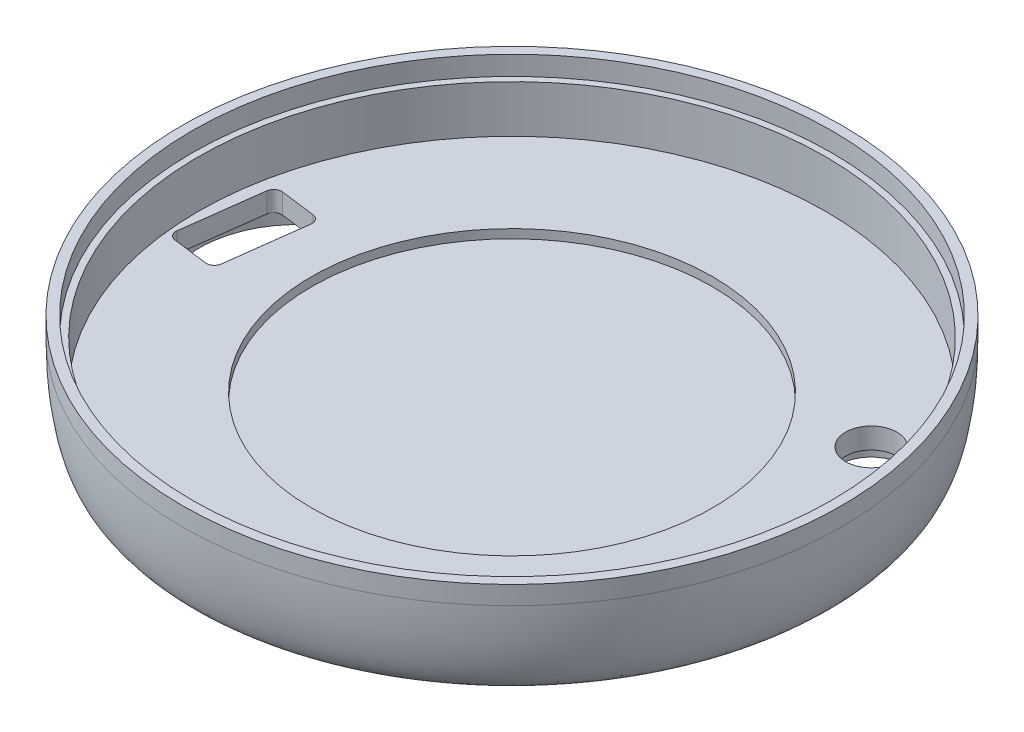
ISO-10303-21;
HEADER;
FILE_DESCRIPTION(('STEP AP214'),'2;1');
FILE_NAME('part.step','',(''),(''),'','','');
FILE_SCHEMA(('AUTOMOTIVE_DESIGN { 1 0 10303 214 1 1 1 1 }'));
ENDSEC;
DATA;
#1=APPLICATION_CONTEXT('core data for automotive mechanical design processes');
#2=APPLICATION_PROTOCOL_DEFINITION('international standard','automotive_design',2000,#1);
#3=PRODUCT_CONTEXT('',#1,'mechanical');
#4=PRODUCT('Part','Part','',(#3));
#5=PRODUCT_RELATED_PRODUCT_CATEGORY('part','',(#4));
#6=PRODUCT_DEFINITION_FORMATION('','',#4);
#7=PRODUCT_DEFINITION_CONTEXT('part definition',#1,'design');
#8=PRODUCT_DEFINITION('design','',#6,#7);
#9=PRODUCT_DEFINITION_SHAPE('','',#8);
#10=(LENGTH_UNIT() NAMED_UNIT(*) SI_UNIT(.MILLI.,.METRE.));
#11=(NAMED_UNIT(*) PLANE_ANGLE_UNIT() SI_UNIT($,.RADIAN.));
#12=(NAMED_UNIT(*) SI_UNIT($,.STERADIAN.) SOLID_ANGLE_UNIT());
#13=UNCERTAINTY_MEASURE_WITH_UNIT(LENGTH_MEASURE(1.E-05),#10,'distance_accuracy_value','');
#14=(GEOMETRIC_REPRESENTATION_CONTEXT(3) GLOBAL_UNCERTAINTY_ASSIGNED_CONTEXT((#13)) GLOBAL_UNIT_ASSIGNED_CONTEXT((#10,
#11,#12)) REPRESENTATION_CONTEXT('',''));
#15=CARTESIAN_POINT('',(0.,0.,0.));
#16=DIRECTION('',(0.,0.,1.));
#17=DIRECTION('',(1.,0.,0.));
#18=AXIS2_PLACEMENT_3D('',#15,#16,#17);
#19=CARTESIAN_POINT('',(14.1508537706222,6.151,-8.2502947048077));
#20=DIRECTION('',(0.,-1.,0.));
#21=DIRECTION('',(0.,0.,-1.));
#22=AXIS2_PLACEMENT_3D('',#19,#20,#21);
#23=CYLINDRICAL_SURFACE('',#22,1.6);
#24=CARTESIAN_POINT('',(14.1508537706222,2.,-8.2502947048077));
#25=DIRECTION('',(0.,1.,0.));
#26=DIRECTION('',(0.,0.,1.));
#27=AXIS2_PLACEMENT_3D('',#24,#25,#26);
#28=CIRCLE('',#27,1.6);
#29=CARTESIAN_POINT('',(14.1508537706222,2.,-6.6502947048077));
#30=VERTEX_POINT('',#29);
#31=EDGE_CURVE('E143',#30,#30,#28,.F.);
#32=ORIENTED_EDGE('',*,*,#31,.F.);
#33=EDGE_LOOP('',(#32));
#34=FACE_BOUND('',#33,.T.);
#35=CARTESIAN_POINT('',(14.1508537706222,0.7,-8.2502947048077));
#36=DIRECTION('',(0.,-1.,0.));
#37=DIRECTION('',(0.,0.,-1.));
#38=AXIS2_PLACEMENT_3D('',#35,#36,#37);
#39=CIRCLE('',#38,1.6);
#40=CARTESIAN_POINT('',(14.1508537706222,0.7,-9.8502947048077));
#41=VERTEX_POINT('',#40);
#42=EDGE_CURVE('E53',#41,#41,#39,.F.);
#43=ORIENTED_EDGE('',*,*,#42,.F.);
#44=EDGE_LOOP('',(#43));
#45=FACE_BOUND('',#44,.T.);
#46=ADVANCED_FACE('F49',(#34,#45),#23,.F.);
#47=CARTESIAN_POINT('',(-19.2297204076441,5.05,2.22079728835427));
#48=DIRECTION('',(0.991724413132395,0.,0.12838492277992));
#49=DIRECTION('',(0.12838492277992,0.,-0.991724413132395));
#50=AXIS2_PLACEMENT_3D('',#47,#48,#49);
#51=PLANE('',#50);
#52=DIRECTION('',(0.,-1.,0.));
#53=VECTOR('',#52,1.);
#54=CARTESIAN_POINT('',(-19.1655279462541,0.,1.72493508178808));
#55=LINE('',#54,#53);
#56=CARTESIAN_POINT('',(-19.1655279462541,2.,1.72493508178808));
#57=VERTEX_POINT('',#56);
#58=CARTESIAN_POINT('',(-19.1655279462541,0.75,1.72493508178808));
#59=VERTEX_POINT('',#58);
#60=EDGE_CURVE('E124',#57,#59,#55,.T.);
#61=ORIENTED_EDGE('',*,*,#60,.T.);
#62=DIRECTION('',(0.12838492277992,0.,-0.991724413132395));
#63=VECTOR('',#62,1.);
#64=CARTESIAN_POINT('',(-19.2297204076441,0.75,2.22079728835427));
#65=LINE('',#64,#63);
#66=CARTESIAN_POINT('',(-18.5236033323545,0.75,-3.2336869838739));
#67=VERTEX_POINT('',#66);
#68=EDGE_CURVE('E274',#59,#67,#65,.T.);
#69=ORIENTED_EDGE('',*,*,#68,.T.);
#70=DIRECTION('',(0.,-1.,0.));
#71=VECTOR('',#70,1.);
#72=CARTESIAN_POINT('',(-18.5236033323545,2.05,-3.2336869838739));
#73=LINE('',#72,#71);
#74=CARTESIAN_POINT('',(-18.5236033323545,2.,-3.2336869838739));
#75=VERTEX_POINT('',#74);
#76=EDGE_CURVE('E120',#67,#75,#73,.F.);
#77=ORIENTED_EDGE('',*,*,#76,.T.);
#78=DIRECTION('',(0.12838492277992,0.,-0.991724413132395));
#79=VECTOR('',#78,1.);
#80=CARTESIAN_POINT('',(-18.4239719344364,2.,-4.00330141748866));
#81=LINE('',#80,#79);
#82=EDGE_CURVE('E114',#57,#75,#81,.T.);
#83=ORIENTED_EDGE('',*,*,#82,.F.);
#84=EDGE_LOOP('',(#61,#69,#77,#83));
#85=FACE_BOUND('',#84,.T.);
#86=ADVANCED_FACE('F186',(#85),#51,.T.);
#87=CARTESIAN_POINT('',(-16.0562022856204,5.05,2.63162904125002));
#88=DIRECTION('',(0.12838492277992,0.,-0.991724413132395));
#89=DIRECTION('',(-0.991724413132395,0.,-0.12838492277992));
#90=AXIS2_PLACEMENT_3D('',#87,#88,#89);
#91=PLANE('',#90);
#92=DIRECTION('',(0.,-1.,0.));
#93=VECTOR('',#92,1.);
#94=CARTESIAN_POINT('',(-16.5520644921866,0.,2.56743657986006));
#95=LINE('',#94,#93);
#96=CARTESIAN_POINT('',(-16.5520644921866,2.,2.56743657986006));
#97=VERTEX_POINT('',#96);
#98=CARTESIAN_POINT('',(-16.5520644921866,0.75,2.56743657986006));
#99=VERTEX_POINT('',#98);
#100=EDGE_CURVE('E111',#97,#99,#95,.T.);
#101=ORIENTED_EDGE('',*,*,#100,.T.);
#102=DIRECTION('',(-0.991724413132395,0.,-0.12838492277992));
#103=VECTOR('',#102,1.);
#104=CARTESIAN_POINT('',(-16.0562022856204,0.75,2.63162904125002));
#105=LINE('',#104,#103);
#106=CARTESIAN_POINT('',(-18.7338582010779,0.75,2.28498974974423));
#107=VERTEX_POINT('',#106);
#108=EDGE_CURVE('E287',#99,#107,#105,.T.);
#109=ORIENTED_EDGE('',*,*,#108,.T.);
#110=DIRECTION('',(0.,-1.,0.));
#111=VECTOR('',#110,1.);
#112=CARTESIAN_POINT('',(-18.7338582010779,2.05,2.28498974974423));
#113=LINE('',#112,#111);
#114=CARTESIAN_POINT('',(-18.7338582010779,2.,2.28498974974423));
#115=VERTEX_POINT('',#114);
#116=EDGE_CURVE('E113',#107,#115,#113,.F.);
#117=ORIENTED_EDGE('',*,*,#116,.T.);
#118=DIRECTION('',(-0.991724413132395,0.,-0.12838492277992));
#119=VECTOR('',#118,1.);
#120=CARTESIAN_POINT('',(11.6942515267923,2.,6.22409870584294));
#121=LINE('',#120,#119);
#122=EDGE_CURVE('E97',#97,#115,#121,.T.);
#123=ORIENTED_EDGE('',*,*,#122,.F.);
#124=EDGE_LOOP('',(#101,#109,#117,#123));
#125=FACE_BOUND('',#124,.T.);
#126=ADVANCED_FACE('F108',(#125),#91,.T.);
#127=CARTESIAN_POINT('',(-15.2858927489409,5.05,-3.31871743754435));
#128=DIRECTION('',(-0.991724413132395,0.,-0.12838492277992));
#129=DIRECTION('',(-0.12838492277992,0.,0.991724413132395));
#130=AXIS2_PLACEMENT_3D('',#127,#128,#129);
#131=PLANE('',#130);
#132=DIRECTION('',(0.,-1.,0.));
#133=VECTOR('',#132,1.);
#134=CARTESIAN_POINT('',(-15.3500852103309,0.,-2.82285523097816));
#135=LINE('',#134,#133);
#136=CARTESIAN_POINT('',(-15.3500852103309,2.,-2.82285523097816));
#137=VERTEX_POINT('',#136);
#138=CARTESIAN_POINT('',(-15.3500852103309,0.75,-2.82285523097816));
#139=VERTEX_POINT('',#138);
#140=EDGE_CURVE('E122',#137,#139,#135,.T.);
#141=ORIENTED_EDGE('',*,*,#140,.T.);
#142=DIRECTION('',(-0.12838492277992,0.,0.991724413132395));
#143=VECTOR('',#142,1.);
#144=CARTESIAN_POINT('',(-15.2858927489409,0.75,-3.31871743754435));
#145=LINE('',#144,#143);
#146=CARTESIAN_POINT('',(-15.9920098242305,0.75,2.13576683468382));
#147=VERTEX_POINT('',#146);
#148=EDGE_CURVE('E338',#139,#147,#145,.T.);
#149=ORIENTED_EDGE('',*,*,#148,.T.);
#150=DIRECTION('',(0.,-1.,0.));
#151=VECTOR('',#150,1.);
#152=CARTESIAN_POINT('',(-15.9920098242305,2.05,2.13576683468382));
#153=LINE('',#152,#151);
#154=CARTESIAN_POINT('',(-15.9920098242305,2.,2.13576683468382));
#155=VERTEX_POINT('',#154);
#156=EDGE_CURVE('E130',#147,#155,#153,.F.);
#157=ORIENTED_EDGE('',*,*,#156,.T.);
#158=DIRECTION('',(-0.12838492277992,0.,0.991724413132395));
#159=VECTOR('',#158,1.);
#160=CARTESIAN_POINT('',(-15.2504538124127,2.,-3.59246966459292));
#161=LINE('',#160,#159);
#162=EDGE_CURVE('E100',#137,#155,#161,.T.);
#163=ORIENTED_EDGE('',*,*,#162,.F.);
#164=EDGE_LOOP('',(#141,#149,#157,#163));
#165=FACE_BOUND('',#164,.T.);
#166=ADVANCED_FACE('F181',(#165),#131,.T.);
#167=CARTESIAN_POINT('',(-18.4594108709646,5.05,-3.7295491904401));
#168=DIRECTION('',(-0.12838492277992,0.,0.991724413132395));
#169=DIRECTION('',(0.991724413132395,0.,0.12838492277992));
#170=AXIS2_PLACEMENT_3D('',#167,#168,#169);
#171=PLANE('',#170);
#172=DIRECTION('',(0.,-1.,0.));
#173=VECTOR('',#172,1.);
#174=CARTESIAN_POINT('',(-17.9635486643984,0.,-3.66535672905014));
#175=LINE('',#174,#173);
#176=CARTESIAN_POINT('',(-17.9635486643984,2.,-3.66535672905014));
#177=VERTEX_POINT('',#176);
#178=CARTESIAN_POINT('',(-17.9635486643984,0.75,-3.66535672905014));
#179=VERTEX_POINT('',#178);
#180=EDGE_CURVE('E266',#177,#179,#175,.T.);
#181=ORIENTED_EDGE('',*,*,#180,.T.);
#182=DIRECTION('',(0.991724413132395,0.,0.12838492277992));
#183=VECTOR('',#182,1.);
#184=CARTESIAN_POINT('',(-18.4594108709646,0.75,-3.7295491904401));
#185=LINE('',#184,#183);
#186=CARTESIAN_POINT('',(-15.7817549555071,0.75,-3.38290989893432));
#187=VERTEX_POINT('',#186);
#188=EDGE_CURVE('E139',#179,#187,#185,.T.);
#189=ORIENTED_EDGE('',*,*,#188,.T.);
#190=DIRECTION('',(0.,-1.,0.));
#191=VECTOR('',#190,1.);
#192=CARTESIAN_POINT('',(-15.7817549555071,2.05,-3.38290989893431));
#193=LINE('',#192,#191);
#194=CARTESIAN_POINT('',(-15.7817549555071,2.,-3.38290989893431));
#195=VERTEX_POINT('',#194);
#196=EDGE_CURVE('E259',#187,#195,#193,.F.);
#197=ORIENTED_EDGE('',*,*,#196,.T.);
#198=DIRECTION('',(0.991724413132395,0.,0.12838492277992));
#199=VECTOR('',#198,1.);
#200=CARTESIAN_POINT('',(12.4645610634718,2.,0.273752227048568));
#201=LINE('',#200,#199);
#202=EDGE_CURVE('E283',#177,#195,#201,.T.);
#203=ORIENTED_EDGE('',*,*,#202,.F.);
#204=EDGE_LOOP('',(#181,#189,#197,#203));
#205=FACE_BOUND('',#204,.T.);
#206=ADVANCED_FACE('F176',(#205),#171,.T.);
#207=CARTESIAN_POINT('',(-18.0277411257883,5.05,-3.16949452248394));
#208=DIRECTION('',(0.,1.,0.));
#209=DIRECTION('',(0.,0.,1.));
#210=AXIS2_PLACEMENT_3D('',#207,#208,#209);
#211=CYLINDRICAL_SURFACE('',#210,0.5);
#212=ORIENTED_EDGE('',*,*,#76,.F.);
#213=CARTESIAN_POINT('',(-18.0277411257883,0.75,-3.16949452248394));
#214=DIRECTION('',(0.,-1.,0.));
#215=DIRECTION('',(0.,0.,-1.));
#216=AXIS2_PLACEMENT_3D('',#213,#214,#215);
#217=CIRCLE('',#216,0.5);
#218=EDGE_CURVE('E324',#179,#67,#217,.F.);
#219=ORIENTED_EDGE('',*,*,#218,.F.);
#220=ORIENTED_EDGE('',*,*,#180,.F.);
#221=CARTESIAN_POINT('',(-18.0277411257883,2.,-3.16949452248394));
#222=DIRECTION('',(0.,1.,0.));
#223=DIRECTION('',(0.,0.,1.));
#224=AXIS2_PLACEMENT_3D('',#221,#222,#223);
#225=CIRCLE('',#224,0.5);
#226=EDGE_CURVE('E133',#75,#177,#225,.F.);
#227=ORIENTED_EDGE('',*,*,#226,.F.);
#228=EDGE_LOOP('',(#212,#219,#220,#227));
#229=FACE_BOUND('',#228,.T.);
#230=ADVANCED_FACE('F173',(#229),#211,.F.);
#231=CARTESIAN_POINT('',(-18.6696657396879,5.05,1.78912754317804));
#232=DIRECTION('',(0.,1.,0.));
#233=DIRECTION('',(0.,0.,1.));
#234=AXIS2_PLACEMENT_3D('',#231,#232,#233);
#235=CYLINDRICAL_SURFACE('',#234,0.5);
#236=ORIENTED_EDGE('',*,*,#116,.F.);
#237=CARTESIAN_POINT('',(-18.6696657396879,0.75,1.78912754317804));
#238=DIRECTION('',(0.,-1.,0.));
#239=DIRECTION('',(0.,0.,-1.));
#240=AXIS2_PLACEMENT_3D('',#237,#238,#239);
#241=CIRCLE('',#240,0.5);
#242=EDGE_CURVE('E280',#59,#107,#241,.F.);
#243=ORIENTED_EDGE('',*,*,#242,.F.);
#244=ORIENTED_EDGE('',*,*,#60,.F.);
#245=CARTESIAN_POINT('',(-18.6696657396879,2.,1.78912754317804));
#246=DIRECTION('',(0.,1.,0.));
#247=DIRECTION('',(0.,0.,1.));
#248=AXIS2_PLACEMENT_3D('',#245,#246,#247);
#249=CIRCLE('',#248,0.5);
#250=EDGE_CURVE('E105',#115,#57,#249,.F.);
#251=ORIENTED_EDGE('',*,*,#250,.F.);
#252=EDGE_LOOP('',(#236,#243,#244,#251));
#253=FACE_BOUND('',#252,.T.);
#254=ADVANCED_FACE('F171',(#253),#235,.F.);
#255=CARTESIAN_POINT('',(-16.4878720307967,5.05,2.07157437329386));
#256=DIRECTION('',(0.,1.,0.));
#257=DIRECTION('',(0.,0.,1.));
#258=AXIS2_PLACEMENT_3D('',#255,#256,#257);
#259=CYLINDRICAL_SURFACE('',#258,0.5);
#260=CARTESIAN_POINT('',(-16.4878720307967,0.75,2.07157437329386));
#261=DIRECTION('',(0.,-1.,0.));
#262=DIRECTION('',(0.,0.,-1.));
#263=AXIS2_PLACEMENT_3D('',#260,#261,#262);
#264=CIRCLE('',#263,0.5);
#265=EDGE_CURVE('E119',#99,#147,#264,.F.);
#266=ORIENTED_EDGE('',*,*,#265,.F.);
#267=ORIENTED_EDGE('',*,*,#100,.F.);
#268=CARTESIAN_POINT('',(-16.4878720307967,2.,2.07157437329386));
#269=DIRECTION('',(0.,1.,0.));
#270=DIRECTION('',(0.,0.,1.));
#271=AXIS2_PLACEMENT_3D('',#268,#269,#270);
#272=CIRCLE('',#271,0.5);
#273=EDGE_CURVE('E95',#155,#97,#272,.F.);
#274=ORIENTED_EDGE('',*,*,#273,.F.);
#275=ORIENTED_EDGE('',*,*,#156,.F.);
#276=EDGE_LOOP('',(#266,#267,#274,#275));
#277=FACE_BOUND('',#276,.T.);
#278=ADVANCED_FACE('F117',(#277),#259,.F.);
#279=CARTESIAN_POINT('',(-15.8459474168971,5.05,-2.88704769236812));
#280=DIRECTION('',(0.,1.,0.));
#281=DIRECTION('',(0.,0.,1.));
#282=AXIS2_PLACEMENT_3D('',#279,#280,#281);
#283=CYLINDRICAL_SURFACE('',#282,0.5);
#284=CARTESIAN_POINT('',(-15.8459474168971,0.75,-2.88704769236812));
#285=DIRECTION('',(0.,-1.,0.));
#286=DIRECTION('',(0.,0.,-1.));
#287=AXIS2_PLACEMENT_3D('',#284,#285,#286);
#288=CIRCLE('',#287,0.5);
#289=EDGE_CURVE('E59',#139,#187,#288,.F.);
#290=ORIENTED_EDGE('',*,*,#289,.F.);
#291=ORIENTED_EDGE('',*,*,#140,.F.);
#292=CARTESIAN_POINT('',(-15.8459474168971,2.,-2.88704769236812));
#293=DIRECTION('',(0.,1.,0.));
#294=DIRECTION('',(0.,0.,1.));
#295=AXIS2_PLACEMENT_3D('',#292,#293,#294);
#296=CIRCLE('',#295,0.5);
#297=EDGE_CURVE('E104',#195,#137,#296,.F.);
#298=ORIENTED_EDGE('',*,*,#297,.F.);
#299=ORIENTED_EDGE('',*,*,#196,.F.);
#300=EDGE_LOOP('',(#290,#291,#298,#299));
#301=FACE_BOUND('',#300,.T.);
#302=ADVANCED_FACE('F165',(#301),#283,.F.);
#303=CARTESIAN_POINT('',(12.5,2.,0.));
#304=DIRECTION('',(0.,1.,0.));
#305=DIRECTION('',(0.,0.,1.));
#306=AXIS2_PLACEMENT_3D('',#303,#304,#305);
#307=PLANE('',#306);
#308=ORIENTED_EDGE('',*,*,#31,.T.);
#309=EDGE_LOOP('',(#308));
#310=FACE_BOUND('',#309,.T.);
#311=CARTESIAN_POINT('',(0.,2.,0.));
#312=DIRECTION('',(0.,1.,0.));
#313=DIRECTION('',(0.,0.,1.));
#314=AXIS2_PLACEMENT_3D('',#311,#312,#313);
#315=CIRCLE('',#314,12.5);
#316=CARTESIAN_POINT('',(0.,2.,12.5));
#317=VERTEX_POINT('',#316);
#318=EDGE_CURVE('E305',#317,#317,#315,.F.);
#319=ORIENTED_EDGE('',*,*,#318,.T.);
#320=EDGE_LOOP('',(#319));
#321=FACE_BOUND('',#320,.T.);
#322=CARTESIAN_POINT('',(0.,2.,0.));
#323=DIRECTION('',(0.,1.,0.));
#324=DIRECTION('',(0.,0.,1.));
#325=AXIS2_PLACEMENT_3D('',#322,#323,#324);
#326=CIRCLE('',#325,19.55);
#327=CARTESIAN_POINT('',(0.,2.,19.55));
#328=VERTEX_POINT('',#327);
#329=EDGE_CURVE('E302',#328,#328,#326,.F.);
#330=ORIENTED_EDGE('',*,*,#329,.F.);
#331=EDGE_LOOP('',(#330));
#332=FACE_BOUND('',#331,.T.);
#333=ORIENTED_EDGE('',*,*,#162,.T.);
#334=ORIENTED_EDGE('',*,*,#273,.T.);
#335=ORIENTED_EDGE('',*,*,#122,.T.);
#336=ORIENTED_EDGE('',*,*,#250,.T.);
#337=ORIENTED_EDGE('',*,*,#82,.T.);
#338=ORIENTED_EDGE('',*,*,#226,.T.);
#339=ORIENTED_EDGE('',*,*,#202,.T.);
#340=ORIENTED_EDGE('',*,*,#297,.T.);
#341=EDGE_LOOP('',(#333,#334,#335,#336,#337,#338,#339,#340));
#342=FACE_BOUND('',#341,.T.);
#343=ADVANCED_FACE('F51',(#310,#321,#332,#342),#307,.T.);
#344=CARTESIAN_POINT('',(20.55,0.,0.));
#345=DIRECTION('',(0.,-1.,0.));
#346=DIRECTION('',(0.,0.,-1.));
#347=AXIS2_PLACEMENT_3D('',#344,#345,#346);
#348=PLANE('',#347);
#349=CARTESIAN_POINT('',(14.1508537706222,0.,-8.2502947048077));
#350=DIRECTION('',(0.,-1.,0.));
#351=DIRECTION('',(0.,0.,-1.));
#352=AXIS2_PLACEMENT_3D('',#349,#350,#351);
#353=CIRCLE('',#352,2.05);
#354=CARTESIAN_POINT('',(14.1508537706222,0.,-10.3002947048077));
#355=VERTEX_POINT('',#354);
#356=EDGE_CURVE('E346',#355,#355,#353,.T.);
#357=ORIENTED_EDGE('',*,*,#356,.F.);
#358=EDGE_LOOP('',(#357));
#359=FACE_BOUND('',#358,.T.);
#360=CARTESIAN_POINT('',(0.,0.,-19.5));
#361=CARTESIAN_POINT('',(-2.55254402992546,0.,-19.5));
#362=CARTESIAN_POINT('',(-5.10408374603865,0.,-18.9924671946043));
#363=CARTESIAN_POINT('',(-9.8205701161999,0.,-17.0388345733359));
#364=CARTESIAN_POINT('',(-11.9836610403014,0.,-15.593503425974));
#365=CARTESIAN_POINT('',(-15.5935034259741,0.,-11.9836610403013));
#366=CARTESIAN_POINT('',(-17.0388345733315,0.,-9.82057011619874));
#367=CARTESIAN_POINT('',(-18.9924671946088,0.,-5.1040837460397));
#368=CARTESIAN_POINT('',(-19.5,0.,-2.55254402992294));
#369=CARTESIAN_POINT('',(-19.5,0.,2.55254402992288));
#370=CARTESIAN_POINT('',(-18.9924671946043,0.,5.10408374603976));
#371=CARTESIAN_POINT('',(-17.0388345733359,0.,9.8205701161988));
#372=CARTESIAN_POINT('',(-15.5935034259696,0.,11.9836610403013));
#373=CARTESIAN_POINT('',(-11.9836610403058,0.,15.593503425974));
#374=CARTESIAN_POINT('',(-9.82057011619764,0.,17.0388345733359));
#375=CARTESIAN_POINT('',(-5.10408374604081,0.,18.9924671946043));
#376=CARTESIAN_POINT('',(-2.55254402992291,0.,19.5));
#377=CARTESIAN_POINT('',(2.55254402992291,0.,19.5));
#378=CARTESIAN_POINT('',(5.10408374603976,0.,18.9924671946043));
#379=CARTESIAN_POINT('',(9.8205701161988,0.,17.0388345733359));
#380=CARTESIAN_POINT('',(11.9836610403013,0.,15.5935034259718));
#381=CARTESIAN_POINT('',(15.593503425974,0.,11.9836610403035));
#382=CARTESIAN_POINT('',(17.0388345733357,0.,9.82057011619964));
#383=CARTESIAN_POINT('',(18.9924671946045,0.,5.10408374603888));
#384=CARTESIAN_POINT('',(19.5,0.,2.55254402992291));
#385=CARTESIAN_POINT('',(19.5,0.,-2.55254402992291));
#386=CARTESIAN_POINT('',(18.9924671946001,0.,-5.10408374603997));
#387=CARTESIAN_POINT('',(17.0388345733401,0.,-9.82057011619852));
#388=CARTESIAN_POINT('',(15.5935034259724,0.,-11.9836610403008));
#389=CARTESIAN_POINT('',(11.983661040303,0.,-15.5935034259746));
#390=CARTESIAN_POINT('',(9.82057011619886,0.,-17.0388345733346));
#391=CARTESIAN_POINT('',(5.10408374603964,0.,-18.9924671946056));
#392=CARTESIAN_POINT('',(2.55254402992546,0.,-19.5));
#393=CARTESIAN_POINT('',(0.,0.,-19.5));
#394=(BOUNDED_CURVE() B_SPLINE_CURVE(3,(#360,#361,#362,#363,#364,#365,#366,#367,#368,#369,#370,
#371,#372,#373,#374,#375,#376,#377,#378,#379,#380,#381,#382,#383,#384,#385,#386,#387,#388,#389,
#390,#391,#392,#393),.UNSPECIFIED.,.T.,.F.) B_SPLINE_CURVE_WITH_KNOTS((4,2,2,2,2,2,2,2,2,2,2,2,
2,2,2,2,4),(0.,0.392699081698725,0.785398163397448,1.17809724509617,1.5707963267949,
1.96349540849362,2.35619449019234,2.74889357189107,3.14159265358979,3.53429173528852,
3.92699081698724,4.31968989868597,4.71238898038469,5.10508806208341,5.49778714378214,
5.89048622548086,6.28318530717959),
.UNSPECIFIED.) CURVE() GEOMETRIC_REPRESENTATION_ITEM() RATIONAL_B_SPLINE_CURVE((1.,1.,1.,1.,1.,
1.,1.,1.,1.,1.,1.,1.,1.,1.,1.,1.,1.,1.,1.,1.,1.,1.,1.,1.,1.,1.,1.,1.,1.,1.,1.,1.,1.,1.)) REPRESENTATION_ITEM(''));
#395=CARTESIAN_POINT('',(-19.4777794029963,0.,-0.927911113979107));
#396=VERTEX_POINT('',#395);
#397=CARTESIAN_POINT('',(-19.4854350389975,0.,0.751052351331158));
#398=VERTEX_POINT('',#397);
#399=EDGE_CURVE('E245',#396,#398,#394,.F.);
#400=ORIENTED_EDGE('',*,*,#399,.T.);
#401=CARTESIAN_POINT('',(-13.4902658774672,0.,-0.0612283866981011));
#402=DIRECTION('',(0.,-1.,0.));
#403=DIRECTION('',(0.,0.,-1.));
#404=AXIS2_PLACEMENT_3D('',#401,#402,#403);
#405=CIRCLE('',#404,6.05);
#406=EDGE_CURVE('E140',#396,#398,#405,.T.);
#407=ORIENTED_EDGE('',*,*,#406,.F.);
#408=EDGE_LOOP('',(#400,#407));
#409=FACE_BOUND('',#408,.T.);
#410=ADVANCED_FACE('F211',(#359,#409),#348,.T.);
#411=CARTESIAN_POINT('',(0.,1.45,0.));
#412=DIRECTION('',(0.,1.,0.));
#413=DIRECTION('',(0.,0.,1.));
#414=AXIS2_PLACEMENT_3D('',#411,#412,#413);
#415=PLANE('',#414);
#416=CARTESIAN_POINT('',(0.,1.45,0.));
#417=DIRECTION('',(0.,-1.,0.));
#418=DIRECTION('',(0.,0.,-1.));
#419=AXIS2_PLACEMENT_3D('',#416,#417,#418);
#420=CIRCLE('',#419,12.5);
#421=CARTESIAN_POINT('',(0.,1.45,-12.5));
#422=VERTEX_POINT('',#421);
#423=EDGE_CURVE('E303',#422,#422,#420,.T.);
#424=ORIENTED_EDGE('',*,*,#423,.F.);
#425=EDGE_LOOP('',(#424));
#426=FACE_BOUND('',#425,.T.);
#427=ADVANCED_FACE('F214',(#426),#415,.T.);
#428=CARTESIAN_POINT('',(0.,0.,0.));
#429=DIRECTION('',(0.,-1.,0.));
#430=DIRECTION('',(0.,0.,-1.));
#431=AXIS2_PLACEMENT_3D('',#428,#429,#430);
#432=CYLINDRICAL_SURFACE('',#431,12.5);
#433=ORIENTED_EDGE('',*,*,#423,.T.);
#434=EDGE_LOOP('',(#433));
#435=FACE_BOUND('',#434,.T.);
#436=ORIENTED_EDGE('',*,*,#318,.F.);
#437=EDGE_LOOP('',(#436));
#438=FACE_BOUND('',#437,.T.);
#439=ADVANCED_FACE('F365',(#435,#438),#432,.F.);
#440=CARTESIAN_POINT('',(0.,0.,0.));
#441=DIRECTION('',(0.,-1.,0.));
#442=DIRECTION('',(0.,0.,-1.));
#443=AXIS2_PLACEMENT_3D('',#440,#441,#442);
#444=CYLINDRICAL_SURFACE('',#443,19.55);
#445=ORIENTED_EDGE('',*,*,#329,.T.);
#446=EDGE_LOOP('',(#445));
#447=FACE_BOUND('',#446,.T.);
#448=CARTESIAN_POINT('',(0.,4.95,0.));
#449=DIRECTION('',(0.,-1.,0.));
#450=DIRECTION('',(0.,0.,-1.));
#451=AXIS2_PLACEMENT_3D('',#448,#449,#450);
#452=CIRCLE('',#451,19.55);
#453=CARTESIAN_POINT('',(0.,4.95,-19.55));
#454=VERTEX_POINT('',#453);
#455=EDGE_CURVE('E300',#454,#454,#452,.T.);
#456=ORIENTED_EDGE('',*,*,#455,.F.);
#457=EDGE_LOOP('',(#456));
#458=FACE_BOUND('',#457,.T.);
#459=ADVANCED_FACE('F362',(#447,#458),#444,.F.);
#460=CARTESIAN_POINT('',(19.55,4.95,0.));
#461=DIRECTION('',(0.,1.,0.));
#462=DIRECTION('',(0.,0.,1.));
#463=AXIS2_PLACEMENT_3D('',#460,#461,#462);
#464=PLANE('',#463);
#465=ORIENTED_EDGE('',*,*,#455,.T.);
#466=EDGE_LOOP('',(#465));
#467=FACE_BOUND('',#466,.T.);
#468=CARTESIAN_POINT('',(0.,4.95,0.));
#469=DIRECTION('',(0.,-1.,0.));
#470=DIRECTION('',(0.,0.,-1.));
#471=AXIS2_PLACEMENT_3D('',#468,#469,#470);
#472=CIRCLE('',#471,19.95);
#473=CARTESIAN_POINT('',(0.,4.95,-19.95));
#474=VERTEX_POINT('',#473);
#475=EDGE_CURVE('E297',#474,#474,#472,.T.);
#476=ORIENTED_EDGE('',*,*,#475,.F.);
#477=EDGE_LOOP('',(#476));
#478=FACE_BOUND('',#477,.T.);
#479=ADVANCED_FACE('F364',(#467,#478),#464,.T.);
#480=CARTESIAN_POINT('',(0.,0.,0.));
#481=DIRECTION('',(0.,-1.,0.));
#482=DIRECTION('',(0.,0.,-1.));
#483=AXIS2_PLACEMENT_3D('',#480,#481,#482);
#484=CYLINDRICAL_SURFACE('',#483,19.95);
#485=ORIENTED_EDGE('',*,*,#475,.T.);
#486=EDGE_LOOP('',(#485));
#487=FACE_BOUND('',#486,.T.);
#488=CARTESIAN_POINT('',(0.,6.15,0.));
#489=DIRECTION('',(0.,-1.,0.));
#490=DIRECTION('',(0.,0.,-1.));
#491=AXIS2_PLACEMENT_3D('',#488,#489,#490);
#492=CIRCLE('',#491,19.95);
#493=CARTESIAN_POINT('',(0.,6.15,-19.95));
#494=VERTEX_POINT('',#493);
#495=EDGE_CURVE('E294',#494,#494,#492,.T.);
#496=ORIENTED_EDGE('',*,*,#495,.F.);
#497=EDGE_LOOP('',(#496));
#498=FACE_BOUND('',#497,.T.);
#499=ADVANCED_FACE('F371',(#487,#498),#484,.F.);
#500=CARTESIAN_POINT('',(19.95,6.15,0.));
#501=DIRECTION('',(0.,1.,0.));
#502=DIRECTION('',(0.,0.,1.));
#503=AXIS2_PLACEMENT_3D('',#500,#501,#502);
#504=PLANE('',#503);
#505=ORIENTED_EDGE('',*,*,#495,.T.);
#506=EDGE_LOOP('',(#505));
#507=FACE_BOUND('',#506,.T.);
#508=CARTESIAN_POINT('',(0.,6.15,0.));
#509=DIRECTION('',(0.,-1.,0.));
#510=DIRECTION('',(0.,0.,-1.));
#511=AXIS2_PLACEMENT_3D('',#508,#509,#510);
#512=CIRCLE('',#511,20.55);
#513=CARTESIAN_POINT('',(0.,6.15,-20.55));
#514=VERTEX_POINT('',#513);
#515=EDGE_CURVE('E291',#514,#514,#512,.T.);
#516=ORIENTED_EDGE('',*,*,#515,.F.);
#517=EDGE_LOOP('',(#516));
#518=FACE_BOUND('',#517,.T.);
#519=ADVANCED_FACE('F377',(#507,#518),#504,.T.);
#520=CARTESIAN_POINT('',(0.,0.,0.));
#521=DIRECTION('',(0.,-1.,0.));
#522=DIRECTION('',(0.,0.,-1.));
#523=AXIS2_PLACEMENT_3D('',#520,#521,#522);
#524=CYLINDRICAL_SURFACE('',#523,20.55);
#525=CARTESIAN_POINT('',(0.,5.,-20.55));
#526=CARTESIAN_POINT('',(2.68998870845991,5.,-20.55));
#527=CARTESIAN_POINT('',(5.37891902467169,5.,-20.015138505083));
#528=CARTESIAN_POINT('',(10.3493700455335,5.,-17.9563102811309));
#529=CARTESIAN_POINT('',(12.6289350963181,5.,-16.433153610449));
#530=CARTESIAN_POINT('',(16.433153610449,5.,-12.6289350963181));
#531=CARTESIAN_POINT('',(17.9563102811319,5.,-10.3493700455311));
#532=CARTESIAN_POINT('',(20.0151385050821,5.,-5.37891902467405));
#533=CARTESIAN_POINT('',(20.55,5.,-2.68998870845722));
#534=CARTESIAN_POINT('',(20.55,5.,2.68998870845722));
#535=CARTESIAN_POINT('',(20.015138505082,5.,5.37891902467407));
#536=CARTESIAN_POINT('',(17.9563102811318,5.,10.3493700455311));
#537=CARTESIAN_POINT('',(16.4331536104487,5.,12.6289350963185));
#538=CARTESIAN_POINT('',(12.6289350963184,5.,16.4331536104487));
#539=CARTESIAN_POINT('',(10.3493700455309,5.,17.9563102811319));
#540=CARTESIAN_POINT('',(5.37891902467434,5.,20.0151385050819));
#541=CARTESIAN_POINT('',(2.68998870845722,5.,20.55));
#542=CARTESIAN_POINT('',(-2.68998870845722,5.,20.55));
#543=CARTESIAN_POINT('',(-5.37891902467272,5.,20.0151385050826));
#544=CARTESIAN_POINT('',(-10.3493700455324,5.,17.9563102811313));
#545=CARTESIAN_POINT('',(-12.6289350963196,5.,16.4331536104476));
#546=CARTESIAN_POINT('',(-16.4331536104476,5.,12.6289350963195));
#547=CARTESIAN_POINT('',(-17.9563102811319,5.,10.3493700455309));
#548=CARTESIAN_POINT('',(-20.0151385050819,5.,5.37891902467434));
#549=CARTESIAN_POINT('',(-20.55,5.,2.68998870845719));
#550=CARTESIAN_POINT('',(-20.55,5.,-2.68998870845725));
#551=CARTESIAN_POINT('',(-20.015138505084,5.,-5.37891902466926));
#552=CARTESIAN_POINT('',(-17.9563102811299,5.,-10.3493700455359));
#553=CARTESIAN_POINT('',(-16.4331536104498,5.,-12.6289350963173));
#554=CARTESIAN_POINT('',(-12.6289350963174,5.,-16.4331536104497));
#555=CARTESIAN_POINT('',(-10.3493700455328,5.,-17.9563102811312));
#556=CARTESIAN_POINT('',(-5.37891902467245,5.,-20.0151385050827));
#557=CARTESIAN_POINT('',(-2.68998870845991,5.,-20.55));
#558=CARTESIAN_POINT('',(0.,5.,-20.55));
#559=(BOUNDED_CURVE() B_SPLINE_CURVE(3,(#525,#526,#527,#528,#529,#530,#531,#532,#533,#534,#535,
#536,#537,#538,#539,#540,#541,#542,#543,#544,#545,#546,#547,#548,#549,#550,#551,#552,#553,#554,
#555,#556,#557,#558),.UNSPECIFIED.,.T.,.F.) B_SPLINE_CURVE_WITH_KNOTS((4,2,2,2,2,2,2,2,2,2,2,2,
2,2,2,2,4),(0.,0.392699081698724,0.785398163397448,1.17809724509617,1.5707963267949,
1.96349540849362,2.35619449019234,2.74889357189107,3.14159265358979,3.53429173528852,
3.92699081698724,4.31968989868597,4.71238898038469,5.10508806208341,5.49778714378214,
5.89048622548086,6.28318530717959),
.UNSPECIFIED.) CURVE() GEOMETRIC_REPRESENTATION_ITEM() RATIONAL_B_SPLINE_CURVE((1.,1.,1.,1.,1.,
1.,1.,1.,1.,1.,1.,1.,1.,1.,1.,1.,1.,1.,1.,1.,1.,1.,1.,1.,1.,1.,1.,1.,1.,1.,1.,1.,1.,1.)) REPRESENTATION_ITEM(''));
#560=CARTESIAN_POINT('',(0.,5.,-20.55));
#561=VERTEX_POINT('',#560);
#562=EDGE_CURVE('E235',#561,#561,#559,.F.);
#563=ORIENTED_EDGE('',*,*,#562,.T.);
#564=EDGE_LOOP('',(#563));
#565=FACE_BOUND('',#564,.T.);
#566=ORIENTED_EDGE('',*,*,#515,.T.);
#567=EDGE_LOOP('',(#566));
#568=FACE_BOUND('',#567,.T.);
#569=ADVANCED_FACE('F216',(#565,#568),#524,.T.);
#570=CARTESIAN_POINT('',(0.,0.,-19.5));
#571=CARTESIAN_POINT('',(2.55254402992546,0.,-19.5));
#572=CARTESIAN_POINT('',(5.10408374603964,0.,-18.9924671946056));
#573=CARTESIAN_POINT('',(9.82057011619886,0.,-17.0388345733346));
#574=CARTESIAN_POINT('',(11.983661040303,0.,-15.5935034259746));
#575=CARTESIAN_POINT('',(15.5935034259724,0.,-11.9836610403008));
#576=CARTESIAN_POINT('',(17.0388345733401,0.,-9.82057011619852));
#577=CARTESIAN_POINT('',(18.9924671946001,0.,-5.10408374603997));
#578=CARTESIAN_POINT('',(19.5,0.,-2.55254402992291));
#579=CARTESIAN_POINT('',(19.5,0.,2.55254402992291));
#580=CARTESIAN_POINT('',(18.9924671946045,0.,5.10408374603888));
#581=CARTESIAN_POINT('',(17.0388345733357,0.,9.82057011619964));
#582=CARTESIAN_POINT('',(15.593503425974,0.,11.9836610403035));
#583=CARTESIAN_POINT('',(11.9836610403013,0.,15.5935034259718));
#584=CARTESIAN_POINT('',(9.8205701161988,0.,17.0388345733359));
#585=CARTESIAN_POINT('',(5.10408374603976,0.,18.9924671946043));
#586=CARTESIAN_POINT('',(2.55254402992291,0.,19.5));
#587=CARTESIAN_POINT('',(-2.55254402992291,0.,19.5));
#588=CARTESIAN_POINT('',(-5.10408374604081,0.,18.9924671946043));
#589=CARTESIAN_POINT('',(-9.82057011619764,0.,17.0388345733359));
#590=CARTESIAN_POINT('',(-11.9836610403058,0.,15.593503425974));
#591=CARTESIAN_POINT('',(-15.5935034259696,0.,11.9836610403013));
#592=CARTESIAN_POINT('',(-17.0388345733359,0.,9.8205701161988));
#593=CARTESIAN_POINT('',(-18.9924671946043,0.,5.10408374603976));
#594=CARTESIAN_POINT('',(-19.5,0.,2.55254402992288));
#595=CARTESIAN_POINT('',(-19.5,0.,-2.55254402992294));
#596=CARTESIAN_POINT('',(-18.9924671946088,0.,-5.1040837460397));
#597=CARTESIAN_POINT('',(-17.0388345733315,0.,-9.82057011619874));
#598=CARTESIAN_POINT('',(-15.5935034259741,0.,-11.9836610403013));
#599=CARTESIAN_POINT('',(-11.9836610403014,0.,-15.593503425974));
#600=CARTESIAN_POINT('',(-9.8205701161999,0.,-17.0388345733359));
#601=CARTESIAN_POINT('',(-5.10408374603865,0.,-18.9924671946043));
#602=CARTESIAN_POINT('',(-2.55254402992546,0.,-19.5));
#603=CARTESIAN_POINT('',(0.,0.,-19.5));
#604=CARTESIAN_POINT('',(0.,0.,-20.55));
#605=CARTESIAN_POINT('',(2.68998870845991,3.32096854058439E-12,-20.55));
#606=CARTESIAN_POINT('',(5.37891902467261,0.,-20.0151385050853));
#607=CARTESIAN_POINT('',(10.3493700455326,0.,-17.9563102811286));
#608=CARTESIAN_POINT('',(12.6289350963192,0.,-16.4331536104501));
#609=CARTESIAN_POINT('',(16.4331536104479,0.,-12.628935096317));
#610=CARTESIAN_POINT('',(17.9563102811342,-1.10612215178842E-12,-10.3493700455321));
#611=CARTESIAN_POINT('',(20.0151385050797,1.1078568752644E-12,-5.37891902467308));
#612=CARTESIAN_POINT('',(20.55,0.,-2.68998870845722));
#613=CARTESIAN_POINT('',(20.55,0.,2.68998870845722));
#614=CARTESIAN_POINT('',(20.0151385050797,0.,5.3789190246731));
#615=CARTESIAN_POINT('',(17.9563102811342,0.,10.3493700455321));
#616=CARTESIAN_POINT('',(16.4331536104498,1.1069895135312E-12,12.6289350963174));
#617=CARTESIAN_POINT('',(12.6289350963173,-1.1069895135312E-12,16.4331536104498));
#618=CARTESIAN_POINT('',(10.3493700455318,0.,17.9563102811341));
#619=CARTESIAN_POINT('',(5.37891902467343,0.,20.0151385050797));
#620=CARTESIAN_POINT('',(2.68998870845722,0.,20.55));
#621=CARTESIAN_POINT('',(-2.68998870845722,0.,20.55));
#622=CARTESIAN_POINT('',(-5.37891902467337,0.,20.0151385050842));
#623=CARTESIAN_POINT('',(-10.3493700455318,0.,17.9563102811297));
#624=CARTESIAN_POINT('',(-12.6289350963174,0.,16.4331536104498));
#625=CARTESIAN_POINT('',(-16.4331536104498,0.,12.6289350963173));
#626=CARTESIAN_POINT('',(-17.9563102811341,1.1069895135312E-12,10.3493700455318));
#627=CARTESIAN_POINT('',(-20.0151385050797,-1.1069895135312E-12,5.37891902467343));
#628=CARTESIAN_POINT('',(-20.55,1.1069895135312E-12,2.68998870845719));
#629=CARTESIAN_POINT('',(-20.55,-1.1069895135312E-12,-2.68998870845725));
#630=CARTESIAN_POINT('',(-20.0151385050886,0.,-5.37891902467115));
#631=CARTESIAN_POINT('',(-17.9563102811253,0.,-10.349370045534));
#632=CARTESIAN_POINT('',(-16.4331536104498,-1.10612215179321E-12,-12.6289350963173));
#633=CARTESIAN_POINT('',(-12.6289350963174,1.10785687526919E-12,-16.4331536104497));
#634=CARTESIAN_POINT('',(-10.349370045534,0.,-17.9563102811341));
#635=CARTESIAN_POINT('',(-5.37891902467121,0.,-20.0151385050797));
#636=CARTESIAN_POINT('',(-2.68998870845991,-3.3209685405844E-12,-20.55));
#637=CARTESIAN_POINT('',(0.,0.,-20.55));
#638=CARTESIAN_POINT('',(0.,5.,-20.55));
#639=CARTESIAN_POINT('',(2.68998870845991,5.,-20.55));
#640=CARTESIAN_POINT('',(5.37891902467169,5.,-20.015138505083));
#641=CARTESIAN_POINT('',(10.3493700455335,5.,-17.9563102811309));
#642=CARTESIAN_POINT('',(12.6289350963181,5.,-16.433153610449));
#643=CARTESIAN_POINT('',(16.433153610449,5.,-12.6289350963181));
#644=CARTESIAN_POINT('',(17.9563102811319,5.,-10.3493700455311));
#645=CARTESIAN_POINT('',(20.0151385050821,5.,-5.37891902467405));
#646=CARTESIAN_POINT('',(20.55,5.,-2.68998870845722));
#647=CARTESIAN_POINT('',(20.55,5.,2.68998870845722));
#648=CARTESIAN_POINT('',(20.015138505082,5.,5.37891902467407));
#649=CARTESIAN_POINT('',(17.9563102811318,5.,10.3493700455311));
#650=CARTESIAN_POINT('',(16.4331536104487,5.,12.6289350963185));
#651=CARTESIAN_POINT('',(12.6289350963184,5.,16.4331536104487));
#652=CARTESIAN_POINT('',(10.3493700455309,5.,17.9563102811319));
#653=CARTESIAN_POINT('',(5.37891902467434,5.,20.0151385050819));
#654=CARTESIAN_POINT('',(2.68998870845722,5.,20.55));
#655=CARTESIAN_POINT('',(-2.68998870845722,5.,20.55));
#656=CARTESIAN_POINT('',(-5.37891902467272,5.,20.0151385050826));
#657=CARTESIAN_POINT('',(-10.3493700455324,5.,17.9563102811313));
#658=CARTESIAN_POINT('',(-12.6289350963196,5.,16.4331536104476));
#659=CARTESIAN_POINT('',(-16.4331536104476,5.,12.6289350963195));
#660=CARTESIAN_POINT('',(-17.9563102811319,5.,10.3493700455309));
#661=CARTESIAN_POINT('',(-20.0151385050819,5.,5.37891902467434));
#662=CARTESIAN_POINT('',(-20.55,5.,2.68998870845719));
#663=CARTESIAN_POINT('',(-20.55,5.,-2.68998870845725));
#664=CARTESIAN_POINT('',(-20.015138505084,5.,-5.37891902466926));
#665=CARTESIAN_POINT('',(-17.9563102811299,5.,-10.3493700455359));
#666=CARTESIAN_POINT('',(-16.4331536104498,5.,-12.6289350963173));
#667=CARTESIAN_POINT('',(-12.6289350963174,5.,-16.4331536104497));
#668=CARTESIAN_POINT('',(-10.3493700455328,5.,-17.9563102811312));
#669=CARTESIAN_POINT('',(-5.37891902467245,5.,-20.0151385050827));
#670=CARTESIAN_POINT('',(-2.68998870845991,5.,-20.55));
#671=CARTESIAN_POINT('',(0.,5.,-20.55));
#672=(BOUNDED_SURFACE() B_SPLINE_SURFACE(2,3,((#570,#571,#572,#573,#574,#575,#576,#577,#578,
#579,#580,#581,#582,#583,#584,#585,#586,#587,#588,#589,#590,#591,#592,#593,#594,#595,#596,#597,
#598,#599,#600,#601,#602,#603),(#604,#605,#606,#607,#608,#609,#610,#611,#612,#613,#614,#615,
#616,#617,#618,#619,#620,#621,#622,#623,#624,#625,#626,#627,#628,#629,#630,#631,#632,#633,#634,
#635,#636,#637),(#638,#639,#640,#641,#642,#643,#644,#645,#646,#647,#648,#649,#650,#651,#652,
#653,#654,#655,#656,#657,#658,#659,#660,#661,#662,#663,#664,#665,#666,#667,#668,#669,#670,
#671)),.UNSPECIFIED.,.F.,.T.,.F.) B_SPLINE_SURFACE_WITH_KNOTS((3,3),(4,2,2,2,2,2,2,2,2,2,2,2,2,
2,2,2,4),(0.,1.),(0.,0.392699081698724,0.785398163397448,1.17809724509617,1.5707963267949,
1.96349540849362,2.35619449019234,2.74889357189107,3.14159265358979,3.53429173528852,
3.92699081698724,4.31968989868597,4.71238898038469,5.10508806208341,5.49778714378214,
5.89048622548086,6.28318530717959),
.UNSPECIFIED.) GEOMETRIC_REPRESENTATION_ITEM() RATIONAL_B_SPLINE_SURFACE(((1.,1.,1.,1.,1.,1.,1.,
1.,1.,1.,1.,1.,1.,1.,1.,1.,1.,1.,1.,1.,1.,1.,1.,1.,1.,1.,1.,1.,1.,1.,1.,1.,1.,1.),
(0.707106781186548,0.707106781186548,0.707106781186548,0.707106781186548,0.707106781186548,
0.707106781186548,0.707106781186548,0.707106781186548,0.707106781186548,0.707106781186548,
0.707106781186548,0.707106781186548,0.707106781186548,0.707106781186548,0.707106781186548,
0.707106781186548,0.707106781186548,0.707106781186548,0.707106781186548,0.707106781186548,
0.707106781186548,0.707106781186548,0.707106781186548,0.707106781186548,0.707106781186548,
0.707106781186548,0.707106781186548,0.707106781186548,0.707106781186548,0.707106781186548,
0.707106781186548,0.707106781186548,0.707106781186548,0.707106781186548),(1.,1.,1.,1.,1.,1.,1.,
1.,1.,1.,1.,1.,1.,1.,1.,1.,1.,1.,1.,1.,1.,1.,1.,1.,1.,1.,1.,1.,1.,1.,1.,1.,1.,1.))) REPRESENTATION_ITEM('') SURFACE());
#673=CARTESIAN_POINT('',(-12.2303893454562,-1.91832953551728E-12,5.85613683137727));
#674=CARTESIAN_POINT('',(-12.3968129562218,-1.79426755567655E-12,5.89158907741314));
#675=CARTESIAN_POINT('',(-12.5647363545762,-1.66043467349427E-12,5.91998451740388));
#676=CARTESIAN_POINT('',(-12.9023697080664,-1.37711672976774E-12,5.96253862087311));
#677=CARTESIAN_POINT('',(-13.0720795773031,-1.22763241772953E-12,5.97669796573698));
#678=CARTESIAN_POINT('',(-13.4119702134546,-9.16997197150687E-13,5.99065525321712));
#679=CARTESIAN_POINT('',(-13.5821505684163,-7.5585451450379E-13,5.99046322500478));
#680=CARTESIAN_POINT('',(-13.9218884834824,-4.13103540262504E-13,5.97574990817404));
#681=CARTESIAN_POINT('',(-14.0914460511388,-2.31495497687204E-13,5.9612287938929));
#682=CARTESIAN_POINT('',(-14.4287840919352,1.04496883423953E-13,5.9179530240257));
#683=CARTESIAN_POINT('',(-14.5965640456692,2.58873460676148E-13,5.88919431942263));
#684=CARTESIAN_POINT('',(-14.9291664670471,5.27779654216743E-13,5.81763304812008));
#685=CARTESIAN_POINT('',(-15.0939878227001,6.42294574053609E-13,5.77482531301089));
#686=CARTESIAN_POINT('',(-15.4193468669519,6.75129922082294E-13,5.67550078692038));
#687=CARTESIAN_POINT('',(-15.5798868766505,5.93558936809595E-13,5.61899159897841));
#688=CARTESIAN_POINT('',(-15.8956923260588,9.26117317670337E-13,5.49263140505723));
#689=CARTESIAN_POINT('',(-16.0509559129216,1.34041899994266E-12,5.42277576826728));
#690=CARTESIAN_POINT('',(-16.3550239609492,1.28801787902648E-13,5.27024307013089));
#691=CARTESIAN_POINT('',(-16.5038293467702,-1.49682403517399E-12,5.18756785203679));
#692=CARTESIAN_POINT('',(-16.7939469592145,2.74488803335394E-12,5.00997640568253));
#693=CARTESIAN_POINT('',(-16.93525918545,8.61222631274975E-12,4.91506017678884));
#694=CARTESIAN_POINT('',(-17.2094284458399,-7.67922800038066E-12,4.71363019166688));
#695=CARTESIAN_POINT('',(-17.3422828487007,-2.98466981140511E-11,4.60711285391381));
#696=CARTESIAN_POINT('',(-17.5984991249567,3.04364230821576E-11,4.38330129566676));
#697=CARTESIAN_POINT('',(-17.7218642835534,1.12850633465543E-10,4.26601083599253));
#698=CARTESIAN_POINT('',(-17.9583082509962,-1.12585070174551E-10,4.02142242008495));
#699=CARTESIAN_POINT('',(-18.0713842801261,-4.20540113013152E-10,3.89412177670942));
#700=CARTESIAN_POINT('',(-18.2863687054596,4.20442504228669E-10,3.63049422291105));
#701=CARTESIAN_POINT('',(-18.3882812204615,1.56884085991177E-09,3.49417067148941));
#702=CARTESIAN_POINT('',(-18.5802893976282,-1.56938853684265E-09,3.2133857082131));
#703=CARTESIAN_POINT('',(-18.6703816499362,-5.85758082537189E-09,3.06892196521721));
#704=CARTESIAN_POINT('',(-18.838067144816,5.85672431477059E-09,2.77292866495004));
#705=CARTESIAN_POINT('',(-18.9156618578087,2.18568327177794E-08,2.62139994163114));
#706=CARTESIAN_POINT('',(-19.0492492623775,-1.92264286913666E-08,2.33096610239931));
#707=CARTESIAN_POINT('',(-19.1067178782842,-6.77456563382192E-08,2.1927365968941));
#708=CARTESIAN_POINT('',(-19.2112593936848,6.77477938808707E-08,1.91237438761659));
#709=CARTESIAN_POINT('',(-19.2583319448798,2.5176826113157E-07,1.77024155325046));
#710=CARTESIAN_POINT('',(-19.3208960118131,-1.25665373527756E-07,1.5548879170139));
#711=CARTESIAN_POINT('',(-19.3403964079406,-3.59899475785333E-07,1.48280805250009));
#712=CARTESIAN_POINT('',(-19.376717676654,3.59908925100977E-07,1.33797067589896));
#713=CARTESIAN_POINT('',(-19.3935384784729,1.31398280511076E-06,1.26521314596847));
#714=CARTESIAN_POINT('',(-19.4244697158501,-1.31350353511364E-06,1.11915108491727));
#715=CARTESIAN_POINT('',(-19.4385811378294,-4.89340942080696E-06,1.04584676300686));
#716=CARTESIAN_POINT('',(-19.4577057180678,2.44656684937396E-06,0.935543578669738));
#717=CARTESIAN_POINT('',(-19.463740011456,7.01122383626732E-06,0.898719109326695));
#718=CARTESIAN_POINT('',(-19.4751262288097,-7.01109985124704E-06,0.824965048230096));
#719=CARTESIAN_POINT('',(-19.4804781648407,-2.55976711000555E-05,0.788035458347102));
#720=CARTESIAN_POINT('',(-19.490426266254,2.52834068008929E-05,0.714611879147016));
#721=CARTESIAN_POINT('',(-19.4950321370233,9.3496801700314E-05,0.678119204535932));
#722=CARTESIAN_POINT('',(-19.5035769019994,0.00035726075522362,0.605062095571264));
#723=CARTESIAN_POINT('',(-19.5075158921772,0.000552792971664442,0.568497672310519));
#724=CARTESIAN_POINT('',(-19.5183323628127,0.00121021974079218,0.458698853262932));
#725=CARTESIAN_POINT('',(-19.5242086932554,0.00174292799880577,0.385363706918426));
#726=CARTESIAN_POINT('',(-19.5333408295885,0.00269755826774452,0.237593980653187));
#727=CARTESIAN_POINT('',(-19.5365623196559,0.00311798345118437,0.163157290299449));
#728=CARTESIAN_POINT('',(-19.5402541073264,0.00364568593362992,0.0142144419221351));
#729=CARTESIAN_POINT('',(-19.5407244211336,0.00375296507704772,-0.0602917156896968));
#730=CARTESIAN_POINT('',(-19.5389126897081,0.00361128308882792,-0.209303046458233));
#731=CARTESIAN_POINT('',(-19.5366294309675,0.00336216488277758,-0.283808204699822));
#732=CARTESIAN_POINT('',(-19.5293119602288,0.00261338873643206,-0.432680490183414));
#733=CARTESIAN_POINT('',(-19.5242777786772,0.00211373356901313,-0.507047618943949));
#734=CARTESIAN_POINT('',(-19.511454723576,0.00109961310638575,-0.655666312587116));
#735=CARTESIAN_POINT('',(-19.50366143754,0.000585125307919351,-0.729917499877992));
#736=CARTESIAN_POINT('',(-19.4899150786422,0.000137042738100232,-0.841037793455357));
#737=CARTESIAN_POINT('',(-19.4849900905286,4.16248551553134E-05,-0.87803594961305));
#738=CARTESIAN_POINT('',(-19.4744562820809,-3.25803884679743E-05,-0.951934976711605));
#739=CARTESIAN_POINT('',(-19.4688474591015,-1.13672979489609E-05,-0.988835847275556));
#740=CARTESIAN_POINT('',(-19.45099939447,2.27309979491365E-05,-1.09936421432886));
#741=CARTESIAN_POINT('',(-19.437737105745,6.09129013635634E-06,-1.17282919743636));
#742=CARTESIAN_POINT('',(-19.408503671497,-6.09129068782826E-06,-1.31921602080147));
#743=CARTESIAN_POINT('',(-19.392532525717,-1.63416169763412E-06,-1.39213786100754));
#744=CARTESIAN_POINT('',(-19.3579160544097,1.63287399550156E-06,-1.5372848781025));
#745=CARTESIAN_POINT('',(-19.3392728461151,4.4722807125068E-07,-1.60951055869503));
#746=CARTESIAN_POINT('',(-19.299330335877,-4.47227669916062E-07,-1.75321944417094));
#747=CARTESIAN_POINT('',(-19.2780310357774,-1.56038512031033E-07,-1.8247026495697));
#748=CARTESIAN_POINT('',(-19.2101893317781,3.1202658220073E-07,-2.03789493310124));
#749=CARTESIAN_POINT('',(-19.1596974936109,8.36262230612425E-08,-2.17837027933315));
#750=CARTESIAN_POINT('',(-19.0484863408681,-8.36098019656065E-08,-2.45516494377048));
#751=CARTESIAN_POINT('',(-18.9877690073853,-2.25014953126949E-08,-2.59148506098189));
#752=CARTESIAN_POINT('',(-18.8564252995721,2.25034650254551E-08,-2.8592768797127));
#753=CARTESIAN_POINT('',(-18.7857982146586,6.3945790683895E-09,-2.99074823269484));
#754=CARTESIAN_POINT('',(-18.624453184981,-7.2897677954729E-09,-3.2661509204902));
#755=CARTESIAN_POINT('',(-18.5323067886573,-1.9531776102849E-09,-3.40924808329547));
#756=CARTESIAN_POINT('',(-18.336283451077,1.95394983639309E-09,-3.68718168990279));
#757=CARTESIAN_POINT('',(-18.2324054266632,5.23861845040655E-10,-3.8220173691633));
#758=CARTESIAN_POINT('',(-18.0136369780729,-5.2330172973095E-10,-4.08249005937998));
#759=CARTESIAN_POINT('',(-17.8987441448333,-1.39979809578124E-10,-4.20812504739434));
#760=CARTESIAN_POINT('',(-17.6587376667907,1.407419299277E-10,-4.44931431118937));
#761=CARTESIAN_POINT('',(-17.533620189022,3.79586917076152E-11,-4.56486477265183));
#762=CARTESIAN_POINT('',(-17.2741694913614,-3.72484874680376E-11,-4.78494445845938));
#763=CARTESIAN_POINT('',(-17.1398418088246,-9.75009063150776E-12,-4.88948021079891));
#764=CARTESIAN_POINT('',(-16.8627962238881,1.03661462646837E-11,-5.08691097629981));
#765=CARTESIAN_POINT('',(-16.7200745481721,2.96817931743212E-12,-5.17980069459605));
#766=CARTESIAN_POINT('',(-16.4273247163036,-2.4778616230972E-12,-5.35321538750317));
#767=CARTESIAN_POINT('',(-16.2772972260515,-5.26786177147687E-13,-5.43374148624826));
#768=CARTESIAN_POINT('',(-15.9710603325998,8.68061227385878E-13,-5.5818328990752));
#769=CARTESIAN_POINT('',(-15.8148537553972,3.12966533151151E-13,-5.64940405726692));
#770=CARTESIAN_POINT('',(-15.4972067160257,-1.21952128033915E-13,-5.77118791569792));
#771=CARTESIAN_POINT('',(-15.3357631058124,0.,-5.82539240615504));
#772=CARTESIAN_POINT('',(-15.0089439737697,0.,-5.91998673583745));
#773=CARTESIAN_POINT('',(-14.8435698981786,0.,-5.96038157474922));
#774=CARTESIAN_POINT('',(-14.5100053965988,0.,-6.02709371354843));
#775=CARTESIAN_POINT('',(-14.3418150974411,0.,-6.05341164565228));
#776=CARTESIAN_POINT('',(-14.0038796505139,0.,-6.09178732714542));
#777=CARTESIAN_POINT('',(-13.8341347989362,0.,-6.10384773833638));
#778=CARTESIAN_POINT('',(-13.4144439705538,1.01382554992545E-13,-6.11589966009611));
#779=CARTESIAN_POINT('',(-13.1641887300574,1.53488915846695E-13,-6.10758756540613));
#780=CARTESIAN_POINT('',(-12.7913537920492,2.42257064196174E-13,-6.07202167854967));
#781=CARTESIAN_POINT('',(-12.6675480422808,2.73600222713921E-13,-6.05632740346181));
#782=CARTESIAN_POINT('',(-12.421119432174,3.38312725768455E-13,-6.01731548421477));
#783=CARTESIAN_POINT('',(-12.2984967998042,3.71682452102248E-13,-5.99399639992252));
#784=CARTESIAN_POINT('',(-12.1766728452213,4.05303014435614E-13,-5.96690136660774));
#785=B_SPLINE_CURVE_WITH_KNOTS('',3,(#673,#674,#675,#676,#677,#678,#679,#680,#681,#682,#683,
#684,#685,#686,#687,#688,#689,#690,#691,#692,#693,#694,#695,#696,#697,#698,#699,#700,#701,#702,
#703,#704,#705,#706,#707,#708,#709,#710,#711,#712,#713,#714,#715,#716,#717,#718,#719,#720,#721,
#722,#723,#724,#725,#726,#727,#728,#729,#730,#731,#732,#733,#734,#735,#736,#737,#738,#739,#740,
#741,#742,#743,#744,#745,#746,#747,#748,#749,#750,#751,#752,#753,#754,#755,#756,#757,#758,#759,
#760,#761,#762,#763,#764,#765,#766,#767,#768,#769,#770,#771,#772,#773,#774,#775,#776,#777,#778,
#779,#780,#781,#782,#783,#784),.UNSPECIFIED.,.F.,.F.,(4,2,2,2,2,2,2,2,2,2,2,2,2,2,2,2,2,2,2,2,2,
2,2,2,2,2,2,2,2,2,2,2,2,2,2,2,2,2,2,2,2,2,2,2,2,2,2,2,2,2,2,2,2,2,2,4),(0.,0.510317615190841,
1.02061080377291,1.53054738745545,2.04047776698449,2.55055324858593,3.06081658939699,
3.57079742666415,4.08095553413534,4.59104035686947,5.10112520600255,5.61136797865384,
6.12143330132595,6.63163601688051,7.14164985366536,7.65181049499381,8.16191106851727,
8.61061887852279,9.05934171929726,9.28331314576975,9.50729048625654,9.73118612661594,
9.8431276394631,9.95506717267144,10.0654074034327,10.1757317415473,10.3963949367212,
10.619867514445,10.8433387759256,11.0669085578712,11.2904758654608,11.5144023393278,
11.6263704729253,11.7383390396818,11.962240733091,12.1861424477433,12.4098677227126,
12.6335928423749,13.0809704706292,13.5282615232089,13.9755846653976,14.4855648311383,
14.9955921208541,15.5057312148901,16.0160624324965,16.5260894747623,17.0363475661718,
17.5465592360058,18.0565401996262,18.5668336167705,19.0769420896608,19.587027650839,
20.0970179667685,20.8459858488223,21.2201772960619,21.5944394594395),.UNSPECIFIED.);
#786=EDGE_CURVE('E13',#396,#398,#785,.F.);
#787=ORIENTED_EDGE('',*,*,#562,.F.);
#788=EDGE_LOOP('',(#787));
#789=FACE_BOUND('',#788,.T.);
#790=ORIENTED_EDGE('',*,*,#399,.F.);
#791=ORIENTED_EDGE('',*,*,#786,.T.);
#792=EDGE_LOOP('',(#790,#791));
#793=FACE_BOUND('',#792,.T.);
#794=ADVANCED_FACE('F153',(#789,#793),#672,.T.);
#795=CARTESIAN_POINT('',(-13.4902658774672,0.75,-0.0612283866981011));
#796=DIRECTION('',(0.,-1.,0.));
#797=DIRECTION('',(0.,0.,-1.));
#798=AXIS2_PLACEMENT_3D('',#795,#796,#797);
#799=CYLINDRICAL_SURFACE('',#798,6.05);
#800=ORIENTED_EDGE('',*,*,#786,.F.);
#801=ORIENTED_EDGE('',*,*,#406,.T.);
#802=EDGE_LOOP('',(#800,#801));
#803=FACE_BOUND('',#802,.T.);
#804=CARTESIAN_POINT('',(-13.4902658774672,0.75,-0.0612283866981011));
#805=DIRECTION('',(0.,-1.,0.));
#806=DIRECTION('',(0.,0.,-1.));
#807=AXIS2_PLACEMENT_3D('',#804,#805,#806);
#808=CIRCLE('',#807,6.05);
#809=CARTESIAN_POINT('',(-13.4902658774672,0.75,-6.11122838669811));
#810=VERTEX_POINT('',#809);
#811=EDGE_CURVE('E136',#810,#810,#808,.T.);
#812=ORIENTED_EDGE('',*,*,#811,.F.);
#813=EDGE_LOOP('',(#812));
#814=FACE_BOUND('',#813,.T.);
#815=ADVANCED_FACE('F159',(#803,#814),#799,.F.);
#816=CARTESIAN_POINT('',(-13.4902658774672,0.75,-0.0612283866981011));
#817=DIRECTION('',(0.,-1.,0.));
#818=DIRECTION('',(0.,0.,-1.));
#819=AXIS2_PLACEMENT_3D('',#816,#817,#818);
#820=PLANE('',#819);
#821=ORIENTED_EDGE('',*,*,#811,.T.);
#822=EDGE_LOOP('',(#821));
#823=FACE_BOUND('',#822,.T.);
#824=ORIENTED_EDGE('',*,*,#242,.T.);
#825=ORIENTED_EDGE('',*,*,#108,.F.);
#826=ORIENTED_EDGE('',*,*,#265,.T.);
#827=ORIENTED_EDGE('',*,*,#148,.F.);
#828=ORIENTED_EDGE('',*,*,#289,.T.);
#829=ORIENTED_EDGE('',*,*,#188,.F.);
#830=ORIENTED_EDGE('',*,*,#218,.T.);
#831=ORIENTED_EDGE('',*,*,#68,.F.);
#832=EDGE_LOOP('',(#824,#825,#826,#827,#828,#829,#830,#831));
#833=FACE_BOUND('',#832,.T.);
#834=ADVANCED_FACE('F163',(#823,#833),#820,.T.);
#835=CARTESIAN_POINT('',(14.1508537706222,0.7,-8.2502947048077));
#836=DIRECTION('',(0.,-1.,0.));
#837=DIRECTION('',(0.,0.,-1.));
#838=AXIS2_PLACEMENT_3D('',#835,#836,#837);
#839=PLANE('',#838);
#840=CARTESIAN_POINT('',(14.1508537706222,0.7,-8.2502947048077));
#841=DIRECTION('',(0.,-1.,0.));
#842=DIRECTION('',(0.,0.,-1.));
#843=AXIS2_PLACEMENT_3D('',#840,#841,#842);
#844=CIRCLE('',#843,2.05);
#845=CARTESIAN_POINT('',(14.1508537706222,0.7,-10.3002947048077));
#846=VERTEX_POINT('',#845);
#847=EDGE_CURVE('E349',#846,#846,#844,.T.);
#848=ORIENTED_EDGE('',*,*,#847,.T.);
#849=EDGE_LOOP('',(#848));
#850=FACE_BOUND('',#849,.T.);
#851=ORIENTED_EDGE('',*,*,#42,.T.);
#852=EDGE_LOOP('',(#851));
#853=FACE_BOUND('',#852,.T.);
#854=ADVANCED_FACE('F203',(#850,#853),#839,.T.);
#855=CARTESIAN_POINT('',(14.1508537706222,0.7,-8.2502947048077));
#856=DIRECTION('',(0.,-1.,0.));
#857=DIRECTION('',(0.,0.,-1.));
#858=AXIS2_PLACEMENT_3D('',#855,#856,#857);
#859=CYLINDRICAL_SURFACE('',#858,2.05);
#860=ORIENTED_EDGE('',*,*,#847,.F.);
#861=EDGE_LOOP('',(#860));
#862=FACE_BOUND('',#861,.T.);
#863=ORIENTED_EDGE('',*,*,#356,.T.);
#864=EDGE_LOOP('',(#863));
#865=FACE_BOUND('',#864,.T.);
#866=ADVANCED_FACE('F200',(#862,#865),#859,.F.);
#867=CLOSED_SHELL('',(#46,#86,#126,#166,#206,#230,#254,#278,#302,#343,#410,#427,#439,#459,#479,
#499,#519,#569,#794,#815,#834,#854,#866));
#868=MANIFOLD_SOLID_BREP('B2',#867);
#869=ADVANCED_BREP_SHAPE_REPRESENTATION('',(#18,#868),#14);
#870=SHAPE_DEFINITION_REPRESENTATION(#9,#869);
ENDSEC;
END-ISO-10303-21;
